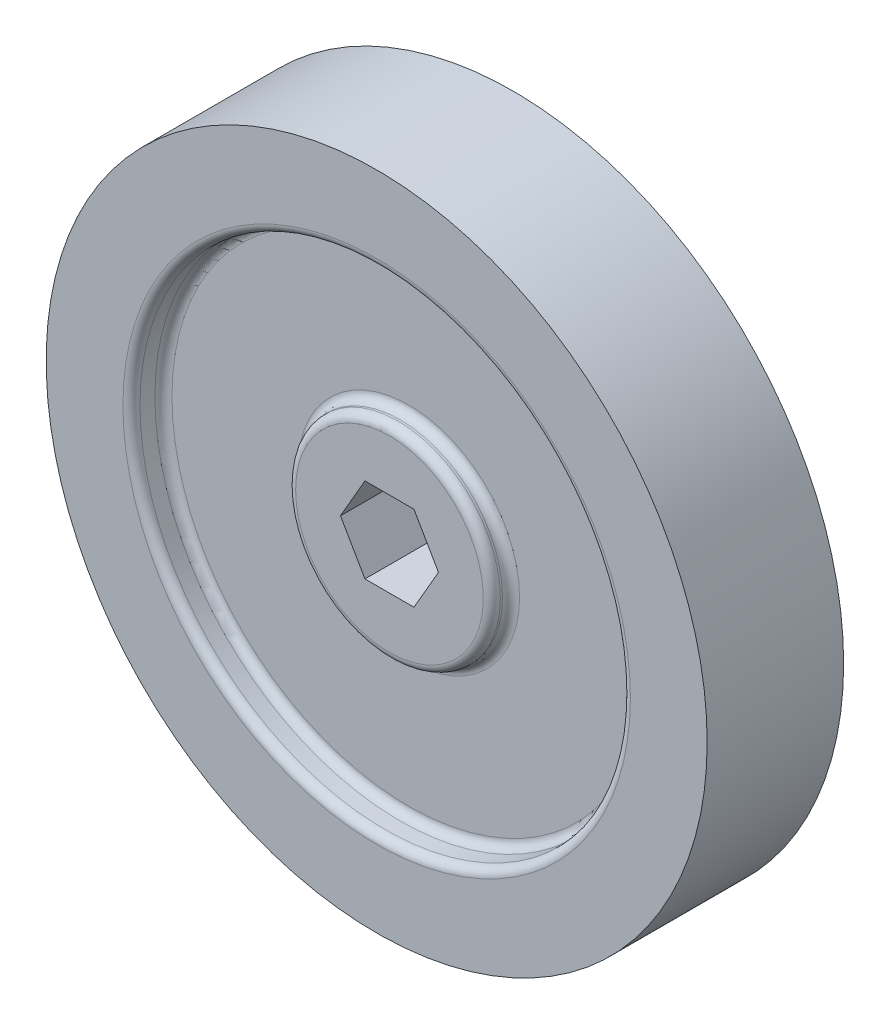
ISO-10303-21;
HEADER;
FILE_DESCRIPTION(('STEP AP214'),'2;1');
FILE_NAME('part.step','',(''),(''),'','','');
FILE_SCHEMA(('AUTOMOTIVE_DESIGN { 1 0 10303 214 1 1 1 1 }'));
ENDSEC;
DATA;
#1=APPLICATION_CONTEXT('core data for automotive mechanical design processes');
#2=APPLICATION_PROTOCOL_DEFINITION('international standard','automotive_design',2000,#1);
#3=PRODUCT_CONTEXT('',#1,'mechanical');
#4=PRODUCT('Part','Part','',(#3));
#5=PRODUCT_RELATED_PRODUCT_CATEGORY('part','',(#4));
#6=PRODUCT_DEFINITION_FORMATION('','',#4);
#7=PRODUCT_DEFINITION_CONTEXT('part definition',#1,'design');
#8=PRODUCT_DEFINITION('design','',#6,#7);
#9=PRODUCT_DEFINITION_SHAPE('','',#8);
#10=(LENGTH_UNIT() NAMED_UNIT(*) SI_UNIT(.MILLI.,.METRE.));
#11=(NAMED_UNIT(*) PLANE_ANGLE_UNIT() SI_UNIT($,.RADIAN.));
#12=(NAMED_UNIT(*) SI_UNIT($,.STERADIAN.) SOLID_ANGLE_UNIT());
#13=UNCERTAINTY_MEASURE_WITH_UNIT(LENGTH_MEASURE(1.E-05),#10,'distance_accuracy_value','');
#14=(GEOMETRIC_REPRESENTATION_CONTEXT(3) GLOBAL_UNCERTAINTY_ASSIGNED_CONTEXT((#13)) GLOBAL_UNIT_ASSIGNED_CONTEXT((#10,
#11,#12)) REPRESENTATION_CONTEXT('',''));
#15=CARTESIAN_POINT('',(0.,0.,0.));
#16=DIRECTION('',(0.,0.,1.));
#17=DIRECTION('',(1.,0.,0.));
#18=AXIS2_PLACEMENT_3D('',#15,#16,#17);
#19=CARTESIAN_POINT('',(0.,0.,-10.16));
#20=DIRECTION('',(0.,0.,1.));
#21=DIRECTION('',(1.,0.,0.));
#22=AXIS2_PLACEMENT_3D('',#19,#20,#21);
#23=CYLINDRICAL_SURFACE('',#22,49.2125);
#24=CARTESIAN_POINT('',(0.,0.,-10.16));
#25=DIRECTION('',(0.,0.,1.));
#26=DIRECTION('',(1.,0.,0.));
#27=AXIS2_PLACEMENT_3D('',#24,#25,#26);
#28=CIRCLE('',#27,49.2125);
#29=CARTESIAN_POINT('',(49.2125,0.,-10.16));
#30=VERTEX_POINT('',#29);
#31=EDGE_CURVE('E119',#30,#30,#28,.T.);
#32=ORIENTED_EDGE('',*,*,#31,.T.);
#33=EDGE_LOOP('',(#32));
#34=FACE_BOUND('',#33,.T.);
#35=CARTESIAN_POINT('',(0.,0.,10.16));
#36=DIRECTION('',(0.,0.,1.));
#37=DIRECTION('',(1.,0.,0.));
#38=AXIS2_PLACEMENT_3D('',#35,#36,#37);
#39=CIRCLE('',#38,49.2125);
#40=CARTESIAN_POINT('',(49.2125,0.,10.16));
#41=VERTEX_POINT('',#40);
#42=EDGE_CURVE('E116',#41,#41,#39,.T.);
#43=ORIENTED_EDGE('',*,*,#42,.F.);
#44=EDGE_LOOP('',(#43));
#45=FACE_BOUND('',#44,.T.);
#46=ADVANCED_FACE('F34',(#34,#45),#23,.T.);
#47=CARTESIAN_POINT('',(0.,0.,-10.16));
#48=DIRECTION('',(0.,0.,1.));
#49=DIRECTION('',(1.,0.,0.));
#50=AXIS2_PLACEMENT_3D('',#47,#48,#49);
#51=PLANE('',#50);
#52=CARTESIAN_POINT('',(0.,0.,-10.16));
#53=DIRECTION('',(0.,0.,1.));
#54=DIRECTION('',(1.,0.,0.));
#55=AXIS2_PLACEMENT_3D('',#52,#53,#54);
#56=CIRCLE('',#55,37.7825);
#57=CARTESIAN_POINT('',(37.7825,0.,-10.16));
#58=VERTEX_POINT('',#57);
#59=EDGE_CURVE('E135',#58,#58,#56,.T.);
#60=ORIENTED_EDGE('',*,*,#59,.T.);
#61=EDGE_LOOP('',(#60));
#62=FACE_BOUND('',#61,.T.);
#63=ORIENTED_EDGE('',*,*,#31,.F.);
#64=EDGE_LOOP('',(#63));
#65=FACE_BOUND('',#64,.T.);
#66=ADVANCED_FACE('F184',(#62,#65),#51,.F.);
#67=CARTESIAN_POINT('',(0.,0.,10.16));
#68=DIRECTION('',(0.,0.,1.));
#69=DIRECTION('',(1.,0.,0.));
#70=AXIS2_PLACEMENT_3D('',#67,#68,#69);
#71=PLANE('',#70);
#72=CARTESIAN_POINT('',(0.,0.,10.16));
#73=DIRECTION('',(0.,0.,1.));
#74=DIRECTION('',(1.,0.,0.));
#75=AXIS2_PLACEMENT_3D('',#72,#73,#74);
#76=CIRCLE('',#75,37.7825);
#77=CARTESIAN_POINT('',(37.7825,0.,10.16));
#78=VERTEX_POINT('',#77);
#79=EDGE_CURVE('E93',#78,#78,#76,.F.);
#80=ORIENTED_EDGE('',*,*,#79,.T.);
#81=EDGE_LOOP('',(#80));
#82=FACE_BOUND('',#81,.T.);
#83=ORIENTED_EDGE('',*,*,#42,.T.);
#84=EDGE_LOOP('',(#83));
#85=FACE_BOUND('',#84,.T.);
#86=ADVANCED_FACE('F190',(#82,#85),#71,.T.);
#87=CARTESIAN_POINT('',(7.29770740255687,0.,-10.16));
#88=DIRECTION('',(0.866025403784438,0.5,0.));
#89=DIRECTION('',(-0.5,0.866025403784438,0.));
#90=AXIS2_PLACEMENT_3D('',#87,#88,#89);
#91=PLANE('',#90);
#92=DIRECTION('',(0.,0.,1.));
#93=VECTOR('',#92,1.);
#94=CARTESIAN_POINT('',(7.29770740255687,0.,-10.16));
#95=LINE('',#94,#93);
#96=CARTESIAN_POINT('',(7.29770740255687,0.,-8.255));
#97=VERTEX_POINT('',#96);
#98=CARTESIAN_POINT('',(7.29770740255687,0.,8.255));
#99=VERTEX_POINT('',#98);
#100=EDGE_CURVE('E102',#97,#99,#95,.T.);
#101=ORIENTED_EDGE('',*,*,#100,.T.);
#102=DIRECTION('',(-0.5,0.866025403784438,0.));
#103=VECTOR('',#102,1.);
#104=CARTESIAN_POINT('',(7.29770740255687,0.,8.255));
#105=LINE('',#104,#103);
#106=CARTESIAN_POINT('',(3.64885370127844,6.32,8.255));
#107=VERTEX_POINT('',#106);
#108=EDGE_CURVE('E87',#99,#107,#105,.T.);
#109=ORIENTED_EDGE('',*,*,#108,.T.);
#110=DIRECTION('',(0.,0.,1.));
#111=VECTOR('',#110,1.);
#112=CARTESIAN_POINT('',(3.64885370127844,6.32,-10.16));
#113=LINE('',#112,#111);
#114=CARTESIAN_POINT('',(3.64885370127844,6.32,-8.255));
#115=VERTEX_POINT('',#114);
#116=EDGE_CURVE('E100',#115,#107,#113,.T.);
#117=ORIENTED_EDGE('',*,*,#116,.F.);
#118=DIRECTION('',(0.5,-0.866025403784438,0.));
#119=VECTOR('',#118,1.);
#120=CARTESIAN_POINT('',(7.29770740255687,0.,-8.255));
#121=LINE('',#120,#119);
#122=EDGE_CURVE('E57',#115,#97,#121,.T.);
#123=ORIENTED_EDGE('',*,*,#122,.T.);
#124=EDGE_LOOP('',(#101,#109,#117,#123));
#125=FACE_BOUND('',#124,.T.);
#126=ADVANCED_FACE('F99',(#125),#91,.F.);
#127=CARTESIAN_POINT('',(3.64885370127844,-6.32,-10.16));
#128=DIRECTION('',(0.866025403784439,-0.5,0.));
#129=DIRECTION('',(0.5,0.866025403784439,0.));
#130=AXIS2_PLACEMENT_3D('',#127,#128,#129);
#131=PLANE('',#130);
#132=DIRECTION('',(0.,0.,1.));
#133=VECTOR('',#132,1.);
#134=CARTESIAN_POINT('',(3.64885370127844,-6.32,-10.16));
#135=LINE('',#134,#133);
#136=CARTESIAN_POINT('',(3.64885370127844,-6.32,-8.255));
#137=VERTEX_POINT('',#136);
#138=CARTESIAN_POINT('',(3.64885370127844,-6.32,8.255));
#139=VERTEX_POINT('',#138);
#140=EDGE_CURVE('E409',#137,#139,#135,.T.);
#141=ORIENTED_EDGE('',*,*,#140,.T.);
#142=DIRECTION('',(0.5,0.866025403784439,0.));
#143=VECTOR('',#142,1.);
#144=CARTESIAN_POINT('',(3.64885370127844,-6.32,8.255));
#145=LINE('',#144,#143);
#146=EDGE_CURVE('E104',#139,#99,#145,.T.);
#147=ORIENTED_EDGE('',*,*,#146,.T.);
#148=ORIENTED_EDGE('',*,*,#100,.F.);
#149=DIRECTION('',(-0.5,-0.866025403784439,0.));
#150=VECTOR('',#149,1.);
#151=CARTESIAN_POINT('',(3.64885370127844,-6.32,-8.255));
#152=LINE('',#151,#150);
#153=EDGE_CURVE('E112',#97,#137,#152,.T.);
#154=ORIENTED_EDGE('',*,*,#153,.T.);
#155=EDGE_LOOP('',(#141,#147,#148,#154));
#156=FACE_BOUND('',#155,.T.);
#157=ADVANCED_FACE('F349',(#156),#131,.F.);
#158=CARTESIAN_POINT('',(-3.64885370127843,-6.32,-10.16));
#159=DIRECTION('',(0.,-1.,0.));
#160=DIRECTION('',(1.,0.,0.));
#161=AXIS2_PLACEMENT_3D('',#158,#159,#160);
#162=PLANE('',#161);
#163=DIRECTION('',(0.,0.,1.));
#164=VECTOR('',#163,1.);
#165=CARTESIAN_POINT('',(-3.64885370127843,-6.32,-10.16));
#166=LINE('',#165,#164);
#167=CARTESIAN_POINT('',(-3.64885370127843,-6.32,-8.255));
#168=VERTEX_POINT('',#167);
#169=CARTESIAN_POINT('',(-3.64885370127843,-6.32,8.255));
#170=VERTEX_POINT('',#169);
#171=EDGE_CURVE('E412',#168,#170,#166,.T.);
#172=ORIENTED_EDGE('',*,*,#171,.T.);
#173=DIRECTION('',(1.,0.,0.));
#174=VECTOR('',#173,1.);
#175=CARTESIAN_POINT('',(-3.64885370127843,-6.32,8.255));
#176=LINE('',#175,#174);
#177=EDGE_CURVE('E427',#170,#139,#176,.T.);
#178=ORIENTED_EDGE('',*,*,#177,.T.);
#179=ORIENTED_EDGE('',*,*,#140,.F.);
#180=DIRECTION('',(-1.,0.,0.));
#181=VECTOR('',#180,1.);
#182=CARTESIAN_POINT('',(-3.64885370127843,-6.32,-8.255));
#183=LINE('',#182,#181);
#184=EDGE_CURVE('E436',#137,#168,#183,.T.);
#185=ORIENTED_EDGE('',*,*,#184,.T.);
#186=EDGE_LOOP('',(#172,#178,#179,#185));
#187=FACE_BOUND('',#186,.T.);
#188=ADVANCED_FACE('F340',(#187),#162,.F.);
#189=CARTESIAN_POINT('',(-7.29770740255687,0.,-10.16));
#190=DIRECTION('',(-0.866025403784439,-0.5,0.));
#191=DIRECTION('',(0.5,-0.866025403784439,0.));
#192=AXIS2_PLACEMENT_3D('',#189,#190,#191);
#193=PLANE('',#192);
#194=DIRECTION('',(0.,0.,1.));
#195=VECTOR('',#194,1.);
#196=CARTESIAN_POINT('',(-7.29770740255687,0.,-10.16));
#197=LINE('',#196,#195);
#198=CARTESIAN_POINT('',(-7.29770740255687,0.,-8.255));
#199=VERTEX_POINT('',#198);
#200=CARTESIAN_POINT('',(-7.29770740255687,0.,8.255));
#201=VERTEX_POINT('',#200);
#202=EDGE_CURVE('E110',#199,#201,#197,.T.);
#203=ORIENTED_EDGE('',*,*,#202,.T.);
#204=DIRECTION('',(0.5,-0.866025403784439,0.));
#205=VECTOR('',#204,1.);
#206=CARTESIAN_POINT('',(-7.29770740255687,0.,8.255));
#207=LINE('',#206,#205);
#208=EDGE_CURVE('E422',#201,#170,#207,.T.);
#209=ORIENTED_EDGE('',*,*,#208,.T.);
#210=ORIENTED_EDGE('',*,*,#171,.F.);
#211=DIRECTION('',(-0.5,0.866025403784439,0.));
#212=VECTOR('',#211,1.);
#213=CARTESIAN_POINT('',(-7.29770740255687,0.,-8.255));
#214=LINE('',#213,#212);
#215=EDGE_CURVE('E423',#168,#199,#214,.T.);
#216=ORIENTED_EDGE('',*,*,#215,.T.);
#217=EDGE_LOOP('',(#203,#209,#210,#216));
#218=FACE_BOUND('',#217,.T.);
#219=ADVANCED_FACE('F331',(#218),#193,.F.);
#220=CARTESIAN_POINT('',(-3.64885370127843,6.32,-10.16));
#221=DIRECTION('',(-0.866025403784439,0.5,0.));
#222=DIRECTION('',(-0.5,-0.866025403784439,0.));
#223=AXIS2_PLACEMENT_3D('',#220,#221,#222);
#224=PLANE('',#223);
#225=DIRECTION('',(0.,0.,1.));
#226=VECTOR('',#225,1.);
#227=CARTESIAN_POINT('',(-3.64885370127843,6.32,-10.16));
#228=LINE('',#227,#226);
#229=CARTESIAN_POINT('',(-3.64885370127844,6.32,-8.255));
#230=VERTEX_POINT('',#229);
#231=CARTESIAN_POINT('',(-3.64885370127843,6.32,8.255));
#232=VERTEX_POINT('',#231);
#233=EDGE_CURVE('E108',#230,#232,#228,.T.);
#234=ORIENTED_EDGE('',*,*,#233,.T.);
#235=DIRECTION('',(-0.5,-0.866025403784439,0.));
#236=VECTOR('',#235,1.);
#237=CARTESIAN_POINT('',(-3.64885370127843,6.32,8.255));
#238=LINE('',#237,#236);
#239=EDGE_CURVE('E49',#232,#201,#238,.T.);
#240=ORIENTED_EDGE('',*,*,#239,.T.);
#241=ORIENTED_EDGE('',*,*,#202,.F.);
#242=DIRECTION('',(0.5,0.866025403784439,0.));
#243=VECTOR('',#242,1.);
#244=CARTESIAN_POINT('',(-3.64885370127843,6.32,-8.255));
#245=LINE('',#244,#243);
#246=EDGE_CURVE('E425',#199,#230,#245,.T.);
#247=ORIENTED_EDGE('',*,*,#246,.T.);
#248=EDGE_LOOP('',(#234,#240,#241,#247));
#249=FACE_BOUND('',#248,.T.);
#250=ADVANCED_FACE('F323',(#249),#224,.F.);
#251=CARTESIAN_POINT('',(3.64885370127844,6.32,-10.16));
#252=DIRECTION('',(0.,1.,0.));
#253=DIRECTION('',(-1.,0.,0.));
#254=AXIS2_PLACEMENT_3D('',#251,#252,#253);
#255=PLANE('',#254);
#256=ORIENTED_EDGE('',*,*,#116,.T.);
#257=DIRECTION('',(-1.,0.,0.));
#258=VECTOR('',#257,1.);
#259=CARTESIAN_POINT('',(3.64885370127844,6.32,8.255));
#260=LINE('',#259,#258);
#261=EDGE_CURVE('E84',#107,#232,#260,.T.);
#262=ORIENTED_EDGE('',*,*,#261,.T.);
#263=ORIENTED_EDGE('',*,*,#233,.F.);
#264=DIRECTION('',(1.,0.,0.));
#265=VECTOR('',#264,1.);
#266=CARTESIAN_POINT('',(3.64885370127844,6.32,-8.255));
#267=LINE('',#266,#265);
#268=EDGE_CURVE('E107',#230,#115,#267,.T.);
#269=ORIENTED_EDGE('',*,*,#268,.T.);
#270=EDGE_LOOP('',(#256,#262,#263,#269));
#271=FACE_BOUND('',#270,.T.);
#272=ADVANCED_FACE('F106',(#271),#255,.F.);
#273=CARTESIAN_POINT('',(0.,0.,-8.255));
#274=DIRECTION('',(0.,0.,1.));
#275=DIRECTION('',(1.,0.,0.));
#276=AXIS2_PLACEMENT_3D('',#273,#274,#275);
#277=PLANE('',#276);
#278=CARTESIAN_POINT('',(0.,0.,-8.255));
#279=DIRECTION('',(0.,0.,1.));
#280=DIRECTION('',(1.,0.,0.));
#281=AXIS2_PLACEMENT_3D('',#278,#279,#280);
#282=CIRCLE('',#281,13.97);
#283=CARTESIAN_POINT('',(13.97,0.,-8.255));
#284=VERTEX_POINT('',#283);
#285=EDGE_CURVE('E94',#284,#284,#282,.F.);
#286=ORIENTED_EDGE('',*,*,#285,.T.);
#287=EDGE_LOOP('',(#286));
#288=FACE_BOUND('',#287,.T.);
#289=ORIENTED_EDGE('',*,*,#268,.F.);
#290=ORIENTED_EDGE('',*,*,#246,.F.);
#291=ORIENTED_EDGE('',*,*,#215,.F.);
#292=ORIENTED_EDGE('',*,*,#184,.F.);
#293=ORIENTED_EDGE('',*,*,#153,.F.);
#294=ORIENTED_EDGE('',*,*,#122,.F.);
#295=EDGE_LOOP('',(#289,#290,#291,#292,#293,#294));
#296=FACE_BOUND('',#295,.T.);
#297=ADVANCED_FACE('F305',(#288,#296),#277,.F.);
#298=CARTESIAN_POINT('',(0.,15.24,-5.3975));
#299=DIRECTION('',(0.,0.,1.));
#300=DIRECTION('',(1.,0.,0.));
#301=AXIS2_PLACEMENT_3D('',#298,#299,#300);
#302=PLANE('',#301);
#303=CARTESIAN_POINT('',(0.,0.,-5.3975));
#304=DIRECTION('',(0.,0.,1.));
#305=DIRECTION('',(1.,0.,0.));
#306=AXIS2_PLACEMENT_3D('',#303,#304,#305);
#307=CIRCLE('',#306,16.51);
#308=CARTESIAN_POINT('',(16.51,0.,-5.3975));
#309=VERTEX_POINT('',#308);
#310=EDGE_CURVE('E129',#309,#309,#307,.T.);
#311=ORIENTED_EDGE('',*,*,#310,.T.);
#312=EDGE_LOOP('',(#311));
#313=FACE_BOUND('',#312,.T.);
#314=CARTESIAN_POINT('',(0.,0.,-5.3975));
#315=DIRECTION('',(0.,0.,-1.));
#316=DIRECTION('',(-1.,0.,0.));
#317=AXIS2_PLACEMENT_3D('',#314,#315,#316);
#318=CIRCLE('',#317,36.5125);
#319=CARTESIAN_POINT('',(-36.5125,0.,-5.3975));
#320=VERTEX_POINT('',#319);
#321=EDGE_CURVE('E103',#320,#320,#318,.T.);
#322=ORIENTED_EDGE('',*,*,#321,.T.);
#323=EDGE_LOOP('',(#322));
#324=FACE_BOUND('',#323,.T.);
#325=ADVANCED_FACE('F296',(#313,#324),#302,.F.);
#326=CARTESIAN_POINT('',(0.,0.,-22.7530353955303));
#327=DIRECTION('',(0.,0.,-1.));
#328=DIRECTION('',(-1.,0.,0.));
#329=AXIS2_PLACEMENT_3D('',#326,#327,#328);
#330=CYLINDRICAL_SURFACE('',#329,36.5125);
#331=CARTESIAN_POINT('',(0.,0.,-8.89));
#332=DIRECTION('',(0.,0.,1.));
#333=DIRECTION('',(1.,0.,0.));
#334=AXIS2_PLACEMENT_3D('',#331,#332,#333);
#335=CIRCLE('',#334,36.5125);
#336=CARTESIAN_POINT('',(36.5125,0.,-8.89));
#337=VERTEX_POINT('',#336);
#338=EDGE_CURVE('E132',#337,#337,#335,.F.);
#339=ORIENTED_EDGE('',*,*,#338,.T.);
#340=EDGE_LOOP('',(#339));
#341=FACE_BOUND('',#340,.T.);
#342=ORIENTED_EDGE('',*,*,#321,.F.);
#343=EDGE_LOOP('',(#342));
#344=FACE_BOUND('',#343,.T.);
#345=ADVANCED_FACE('F288',(#341,#344),#330,.F.);
#346=CARTESIAN_POINT('',(0.,0.,-22.7530353955303));
#347=DIRECTION('',(0.,0.,-1.));
#348=DIRECTION('',(-1.,0.,0.));
#349=AXIS2_PLACEMENT_3D('',#346,#347,#348);
#350=CYLINDRICAL_SURFACE('',#349,15.24);
#351=CARTESIAN_POINT('',(0.,0.,-6.6675));
#352=DIRECTION('',(0.,0.,1.));
#353=DIRECTION('',(1.,0.,0.));
#354=AXIS2_PLACEMENT_3D('',#351,#352,#353);
#355=CIRCLE('',#354,15.24);
#356=CARTESIAN_POINT('',(15.24,0.,-6.6675));
#357=VERTEX_POINT('',#356);
#358=EDGE_CURVE('E126',#357,#357,#355,.F.);
#359=ORIENTED_EDGE('',*,*,#358,.T.);
#360=EDGE_LOOP('',(#359));
#361=FACE_BOUND('',#360,.T.);
#362=CARTESIAN_POINT('',(0.,0.,-6.985));
#363=DIRECTION('',(0.,0.,1.));
#364=DIRECTION('',(1.,0.,0.));
#365=AXIS2_PLACEMENT_3D('',#362,#363,#364);
#366=CIRCLE('',#365,15.24);
#367=CARTESIAN_POINT('',(15.24,0.,-6.985));
#368=VERTEX_POINT('',#367);
#369=EDGE_CURVE('E123',#368,#368,#366,.T.);
#370=ORIENTED_EDGE('',*,*,#369,.T.);
#371=EDGE_LOOP('',(#370));
#372=FACE_BOUND('',#371,.T.);
#373=ADVANCED_FACE('F200',(#361,#372),#350,.T.);
#374=CARTESIAN_POINT('',(0.,0.,-6.6675));
#375=DIRECTION('',(0.,0.,1.));
#376=DIRECTION('',(1.,0.,0.));
#377=AXIS2_PLACEMENT_3D('',#374,#375,#376);
#378=TOROIDAL_SURFACE('',#377,16.51,1.27);
#379=ORIENTED_EDGE('',*,*,#310,.F.);
#380=EDGE_LOOP('',(#379));
#381=FACE_BOUND('',#380,.T.);
#382=ORIENTED_EDGE('',*,*,#358,.F.);
#383=EDGE_LOOP('',(#382));
#384=FACE_BOUND('',#383,.T.);
#385=ADVANCED_FACE('F196',(#381,#384),#378,.F.);
#386=CARTESIAN_POINT('',(0.,0.,-8.89));
#387=DIRECTION('',(0.,0.,1.));
#388=DIRECTION('',(1.,0.,0.));
#389=AXIS2_PLACEMENT_3D('',#386,#387,#388);
#390=TOROIDAL_SURFACE('',#389,37.7825,1.27);
#391=ORIENTED_EDGE('',*,*,#59,.F.);
#392=EDGE_LOOP('',(#391));
#393=FACE_BOUND('',#392,.T.);
#394=ORIENTED_EDGE('',*,*,#338,.F.);
#395=EDGE_LOOP('',(#394));
#396=FACE_BOUND('',#395,.T.);
#397=ADVANCED_FACE('F199',(#393,#396),#390,.T.);
#398=CARTESIAN_POINT('',(0.,0.,-6.985));
#399=DIRECTION('',(0.,0.,1.));
#400=DIRECTION('',(1.,0.,0.));
#401=AXIS2_PLACEMENT_3D('',#398,#399,#400);
#402=TOROIDAL_SURFACE('',#401,13.97,1.27);
#403=ORIENTED_EDGE('',*,*,#369,.F.);
#404=EDGE_LOOP('',(#403));
#405=FACE_BOUND('',#404,.T.);
#406=ORIENTED_EDGE('',*,*,#285,.F.);
#407=EDGE_LOOP('',(#406));
#408=FACE_BOUND('',#407,.T.);
#409=ADVANCED_FACE('F179',(#405,#408),#402,.T.);
#410=CARTESIAN_POINT('',(0.,0.,8.255));
#411=DIRECTION('',(0.,0.,-1.));
#412=DIRECTION('',(1.,0.,0.));
#413=AXIS2_PLACEMENT_3D('',#410,#411,#412);
#414=PLANE('',#413);
#415=CARTESIAN_POINT('',(0.,0.,8.255));
#416=DIRECTION('',(0.,0.,-1.));
#417=DIRECTION('',(-1.,0.,0.));
#418=AXIS2_PLACEMENT_3D('',#415,#416,#417);
#419=CIRCLE('',#418,13.97);
#420=CARTESIAN_POINT('',(-13.97,0.,8.255));
#421=VERTEX_POINT('',#420);
#422=EDGE_CURVE('E11',#421,#421,#419,.F.);
#423=ORIENTED_EDGE('',*,*,#422,.T.);
#424=EDGE_LOOP('',(#423));
#425=FACE_BOUND('',#424,.T.);
#426=ORIENTED_EDGE('',*,*,#146,.F.);
#427=ORIENTED_EDGE('',*,*,#177,.F.);
#428=ORIENTED_EDGE('',*,*,#208,.F.);
#429=ORIENTED_EDGE('',*,*,#239,.F.);
#430=ORIENTED_EDGE('',*,*,#261,.F.);
#431=ORIENTED_EDGE('',*,*,#108,.F.);
#432=EDGE_LOOP('',(#426,#427,#428,#429,#430,#431));
#433=FACE_BOUND('',#432,.T.);
#434=ADVANCED_FACE('F86',(#425,#433),#414,.F.);
#435=CARTESIAN_POINT('',(0.,15.24,5.3975));
#436=DIRECTION('',(0.,0.,-1.));
#437=DIRECTION('',(1.,0.,0.));
#438=AXIS2_PLACEMENT_3D('',#435,#436,#437);
#439=PLANE('',#438);
#440=CARTESIAN_POINT('',(0.,0.,5.3975));
#441=DIRECTION('',(0.,0.,-1.));
#442=DIRECTION('',(-1.,0.,0.));
#443=AXIS2_PLACEMENT_3D('',#440,#441,#442);
#444=CIRCLE('',#443,35.2425);
#445=CARTESIAN_POINT('',(-35.2425,0.,5.3975));
#446=VERTEX_POINT('',#445);
#447=EDGE_CURVE('E151',#446,#446,#444,.F.);
#448=ORIENTED_EDGE('',*,*,#447,.T.);
#449=EDGE_LOOP('',(#448));
#450=FACE_BOUND('',#449,.T.);
#451=CARTESIAN_POINT('',(0.,0.,5.3975));
#452=DIRECTION('',(0.,0.,-1.));
#453=DIRECTION('',(-1.,0.,0.));
#454=AXIS2_PLACEMENT_3D('',#451,#452,#453);
#455=CIRCLE('',#454,16.51);
#456=CARTESIAN_POINT('',(-16.51,0.,5.3975));
#457=VERTEX_POINT('',#456);
#458=EDGE_CURVE('E148',#457,#457,#455,.T.);
#459=ORIENTED_EDGE('',*,*,#458,.T.);
#460=EDGE_LOOP('',(#459));
#461=FACE_BOUND('',#460,.T.);
#462=ADVANCED_FACE('F168',(#450,#461),#439,.F.);
#463=CARTESIAN_POINT('',(0.,0.,22.7530353955303));
#464=DIRECTION('',(0.,0.,1.));
#465=DIRECTION('',(-1.,0.,0.));
#466=AXIS2_PLACEMENT_3D('',#463,#464,#465);
#467=CYLINDRICAL_SURFACE('',#466,36.5125);
#468=CARTESIAN_POINT('',(0.,0.,8.89));
#469=DIRECTION('',(0.,0.,1.));
#470=DIRECTION('',(1.,0.,0.));
#471=AXIS2_PLACEMENT_3D('',#468,#469,#470);
#472=CIRCLE('',#471,36.5125);
#473=CARTESIAN_POINT('',(36.5125,0.,8.89));
#474=VERTEX_POINT('',#473);
#475=EDGE_CURVE('E145',#474,#474,#472,.T.);
#476=ORIENTED_EDGE('',*,*,#475,.T.);
#477=EDGE_LOOP('',(#476));
#478=FACE_BOUND('',#477,.T.);
#479=CARTESIAN_POINT('',(0.,0.,6.6675));
#480=DIRECTION('',(0.,0.,-1.));
#481=DIRECTION('',(-1.,0.,0.));
#482=AXIS2_PLACEMENT_3D('',#479,#480,#481);
#483=CIRCLE('',#482,36.5125);
#484=CARTESIAN_POINT('',(-36.5125,0.,6.6675));
#485=VERTEX_POINT('',#484);
#486=EDGE_CURVE('E142',#485,#485,#483,.T.);
#487=ORIENTED_EDGE('',*,*,#486,.T.);
#488=EDGE_LOOP('',(#487));
#489=FACE_BOUND('',#488,.T.);
#490=ADVANCED_FACE('F170',(#478,#489),#467,.F.);
#491=CARTESIAN_POINT('',(0.,0.,22.7530353955303));
#492=DIRECTION('',(0.,0.,1.));
#493=DIRECTION('',(-1.,0.,0.));
#494=AXIS2_PLACEMENT_3D('',#491,#492,#493);
#495=CYLINDRICAL_SURFACE('',#494,15.24);
#496=CARTESIAN_POINT('',(0.,0.,6.6675));
#497=DIRECTION('',(0.,0.,-1.));
#498=DIRECTION('',(-1.,0.,0.));
#499=AXIS2_PLACEMENT_3D('',#496,#497,#498);
#500=CIRCLE('',#499,15.24);
#501=CARTESIAN_POINT('',(-15.24,0.,6.6675));
#502=VERTEX_POINT('',#501);
#503=EDGE_CURVE('E42',#502,#502,#500,.F.);
#504=ORIENTED_EDGE('',*,*,#503,.T.);
#505=EDGE_LOOP('',(#504));
#506=FACE_BOUND('',#505,.T.);
#507=CARTESIAN_POINT('',(0.,0.,6.985));
#508=DIRECTION('',(0.,0.,-1.));
#509=DIRECTION('',(-1.,0.,0.));
#510=AXIS2_PLACEMENT_3D('',#507,#508,#509);
#511=CIRCLE('',#510,15.24);
#512=CARTESIAN_POINT('',(-15.24,0.,6.985));
#513=VERTEX_POINT('',#512);
#514=EDGE_CURVE('E154',#513,#513,#511,.T.);
#515=ORIENTED_EDGE('',*,*,#514,.T.);
#516=EDGE_LOOP('',(#515));
#517=FACE_BOUND('',#516,.T.);
#518=ADVANCED_FACE('F159',(#506,#517),#495,.T.);
#519=CARTESIAN_POINT('',(0.,0.,8.89));
#520=DIRECTION('',(0.,0.,1.));
#521=DIRECTION('',(1.,0.,0.));
#522=AXIS2_PLACEMENT_3D('',#519,#520,#521);
#523=TOROIDAL_SURFACE('',#522,37.7825,1.27);
#524=ORIENTED_EDGE('',*,*,#475,.F.);
#525=EDGE_LOOP('',(#524));
#526=FACE_BOUND('',#525,.T.);
#527=ORIENTED_EDGE('',*,*,#79,.F.);
#528=EDGE_LOOP('',(#527));
#529=FACE_BOUND('',#528,.T.);
#530=ADVANCED_FACE('F208',(#526,#529),#523,.T.);
#531=CARTESIAN_POINT('',(0.,0.,6.6675));
#532=DIRECTION('',(0.,0.,-1.));
#533=DIRECTION('',(-1.,0.,0.));
#534=AXIS2_PLACEMENT_3D('',#531,#532,#533);
#535=TOROIDAL_SURFACE('',#534,35.2425,1.27);
#536=ORIENTED_EDGE('',*,*,#447,.F.);
#537=EDGE_LOOP('',(#536));
#538=FACE_BOUND('',#537,.T.);
#539=ORIENTED_EDGE('',*,*,#486,.F.);
#540=EDGE_LOOP('',(#539));
#541=FACE_BOUND('',#540,.T.);
#542=ADVANCED_FACE('F165',(#538,#541),#535,.F.);
#543=CARTESIAN_POINT('',(0.,0.,6.6675));
#544=DIRECTION('',(0.,0.,-1.));
#545=DIRECTION('',(-1.,0.,0.));
#546=AXIS2_PLACEMENT_3D('',#543,#544,#545);
#547=TOROIDAL_SURFACE('',#546,16.51,1.27);
#548=ORIENTED_EDGE('',*,*,#503,.F.);
#549=EDGE_LOOP('',(#548));
#550=FACE_BOUND('',#549,.T.);
#551=ORIENTED_EDGE('',*,*,#458,.F.);
#552=EDGE_LOOP('',(#551));
#553=FACE_BOUND('',#552,.T.);
#554=ADVANCED_FACE('F162',(#550,#553),#547,.F.);
#555=CARTESIAN_POINT('',(0.,0.,6.985));
#556=DIRECTION('',(0.,0.,-1.));
#557=DIRECTION('',(-1.,0.,0.));
#558=AXIS2_PLACEMENT_3D('',#555,#556,#557);
#559=TOROIDAL_SURFACE('',#558,13.97,1.27);
#560=ORIENTED_EDGE('',*,*,#422,.F.);
#561=EDGE_LOOP('',(#560));
#562=FACE_BOUND('',#561,.T.);
#563=ORIENTED_EDGE('',*,*,#514,.F.);
#564=EDGE_LOOP('',(#563));
#565=FACE_BOUND('',#564,.T.);
#566=ADVANCED_FACE('F36',(#562,#565),#559,.T.);
#567=CLOSED_SHELL('',(#46,#66,#86,#126,#157,#188,#219,#250,#272,#297,#325,#345,#373,#385,#397,
#409,#434,#462,#490,#518,#530,#542,#554,#566));
#568=MANIFOLD_SOLID_BREP('B2',#567);
#569=ADVANCED_BREP_SHAPE_REPRESENTATION('',(#18,#568),#14);
#570=SHAPE_DEFINITION_REPRESENTATION(#9,#569);
ENDSEC;
END-ISO-10303-21;
